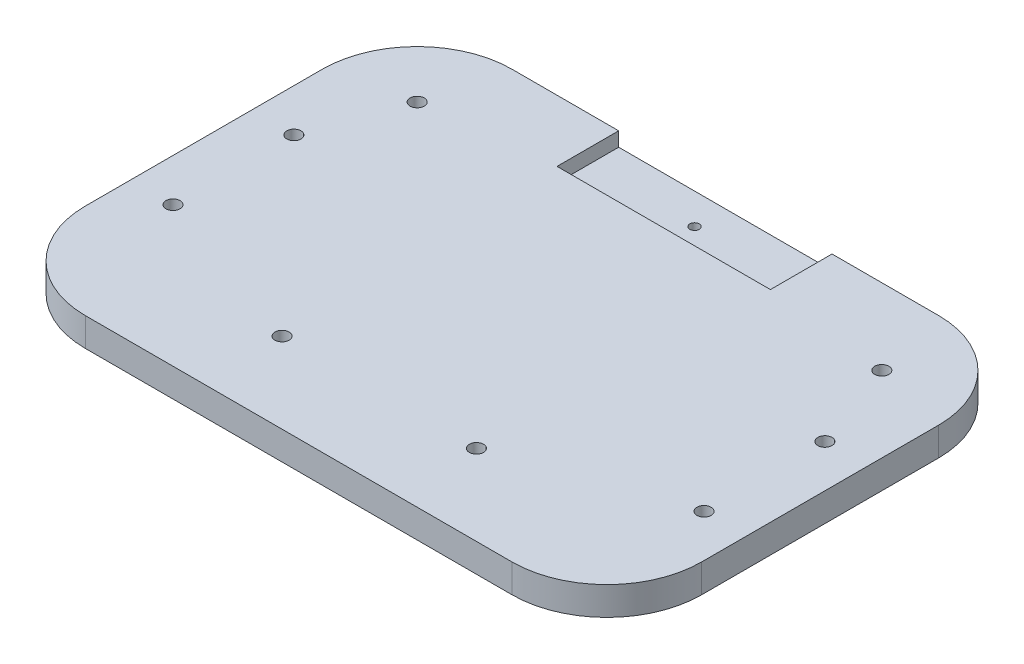
ISO-10303-21;
HEADER;
FILE_DESCRIPTION(('STEP AP214'),'2;1');
FILE_NAME('part.step','',(''),(''),'','','');
FILE_SCHEMA(('AUTOMOTIVE_DESIGN { 1 0 10303 214 1 1 1 1 }'));
ENDSEC;
DATA;
#1=APPLICATION_CONTEXT('core data for automotive mechanical design processes');
#2=APPLICATION_PROTOCOL_DEFINITION('international standard','automotive_design',2000,#1);
#3=PRODUCT_CONTEXT('',#1,'mechanical');
#4=PRODUCT('Part','Part','',(#3));
#5=PRODUCT_RELATED_PRODUCT_CATEGORY('part','',(#4));
#6=PRODUCT_DEFINITION_FORMATION('','',#4);
#7=PRODUCT_DEFINITION_CONTEXT('part definition',#1,'design');
#8=PRODUCT_DEFINITION('design','',#6,#7);
#9=PRODUCT_DEFINITION_SHAPE('','',#8);
#10=(LENGTH_UNIT() NAMED_UNIT(*) SI_UNIT(.MILLI.,.METRE.));
#11=(NAMED_UNIT(*) PLANE_ANGLE_UNIT() SI_UNIT($,.RADIAN.));
#12=(NAMED_UNIT(*) SI_UNIT($,.STERADIAN.) SOLID_ANGLE_UNIT());
#13=UNCERTAINTY_MEASURE_WITH_UNIT(LENGTH_MEASURE(1.E-05),#10,'distance_accuracy_value','');
#14=(GEOMETRIC_REPRESENTATION_CONTEXT(3) GLOBAL_UNCERTAINTY_ASSIGNED_CONTEXT((#13)) GLOBAL_UNIT_ASSIGNED_CONTEXT((#10,
#11,#12)) REPRESENTATION_CONTEXT('',''));
#15=CARTESIAN_POINT('',(0.,0.,0.));
#16=DIRECTION('',(0.,0.,1.));
#17=DIRECTION('',(1.,0.,0.));
#18=AXIS2_PLACEMENT_3D('',#15,#16,#17);
#19=CARTESIAN_POINT('',(-20.,6.,-70.));
#20=DIRECTION('',(0.,-1.,0.));
#21=DIRECTION('',(0.,0.,-1.));
#22=AXIS2_PLACEMENT_3D('',#19,#20,#21);
#23=CYLINDRICAL_SURFACE('',#22,20.);
#24=CARTESIAN_POINT('',(-20.,0.,-70.));
#25=DIRECTION('',(0.,1.,0.));
#26=DIRECTION('',(0.,0.,1.));
#27=AXIS2_PLACEMENT_3D('',#24,#25,#26);
#28=CIRCLE('',#27,20.);
#29=CARTESIAN_POINT('',(0.,0.,-70.));
#30=VERTEX_POINT('',#29);
#31=CARTESIAN_POINT('',(-20.,0.,-90.));
#32=VERTEX_POINT('',#31);
#33=EDGE_CURVE('E161',#30,#32,#28,.T.);
#34=ORIENTED_EDGE('',*,*,#33,.T.);
#35=DIRECTION('',(0.,-1.,0.));
#36=VECTOR('',#35,1.);
#37=CARTESIAN_POINT('',(-20.,6.,-90.));
#38=LINE('',#37,#36);
#39=CARTESIAN_POINT('',(-20.,6.,-90.));
#40=VERTEX_POINT('',#39);
#41=EDGE_CURVE('E11',#40,#32,#38,.T.);
#42=ORIENTED_EDGE('',*,*,#41,.F.);
#43=CARTESIAN_POINT('',(-20.,6.,-70.));
#44=DIRECTION('',(0.,1.,0.));
#45=DIRECTION('',(0.,0.,1.));
#46=AXIS2_PLACEMENT_3D('',#43,#44,#45);
#47=CIRCLE('',#46,20.);
#48=CARTESIAN_POINT('',(0.,6.,-70.));
#49=VERTEX_POINT('',#48);
#50=EDGE_CURVE('E185',#49,#40,#47,.T.);
#51=ORIENTED_EDGE('',*,*,#50,.F.);
#52=DIRECTION('',(0.,-1.,0.));
#53=VECTOR('',#52,1.);
#54=CARTESIAN_POINT('',(0.,6.,-70.));
#55=LINE('',#54,#53);
#56=EDGE_CURVE('E157',#49,#30,#55,.T.);
#57=ORIENTED_EDGE('',*,*,#56,.T.);
#58=EDGE_LOOP('',(#34,#42,#51,#57));
#59=FACE_BOUND('',#58,.T.);
#60=ADVANCED_FACE('F45',(#59),#23,.T.);
#61=CARTESIAN_POINT('',(-20.,6.,-90.));
#62=DIRECTION('',(0.,0.,1.));
#63=DIRECTION('',(1.,0.,0.));
#64=AXIS2_PLACEMENT_3D('',#61,#62,#63);
#65=PLANE('',#64);
#66=DIRECTION('',(-1.,0.,0.));
#67=VECTOR('',#66,1.);
#68=CARTESIAN_POINT('',(-20.,6.,-90.));
#69=LINE('',#68,#67);
#70=CARTESIAN_POINT('',(-87.5,6.,-90.));
#71=VERTEX_POINT('',#70);
#72=CARTESIAN_POINT('',(-110.,6.,-90.));
#73=VERTEX_POINT('',#72);
#74=EDGE_CURVE('E314',#71,#73,#69,.T.);
#75=ORIENTED_EDGE('',*,*,#74,.F.);
#76=DIRECTION('',(0.,1.,0.));
#77=VECTOR('',#76,1.);
#78=CARTESIAN_POINT('',(-87.5,3.,-90.));
#79=LINE('',#78,#77);
#80=CARTESIAN_POINT('',(-87.5,3.,-90.));
#81=VERTEX_POINT('',#80);
#82=EDGE_CURVE('E166',#81,#71,#79,.T.);
#83=ORIENTED_EDGE('',*,*,#82,.F.);
#84=DIRECTION('',(-1.,0.,0.));
#85=VECTOR('',#84,1.);
#86=CARTESIAN_POINT('',(-87.5,3.,-90.));
#87=LINE('',#86,#85);
#88=CARTESIAN_POINT('',(-42.5,3.,-90.));
#89=VERTEX_POINT('',#88);
#90=EDGE_CURVE('E287',#89,#81,#87,.T.);
#91=ORIENTED_EDGE('',*,*,#90,.F.);
#92=DIRECTION('',(0.,1.,0.));
#93=VECTOR('',#92,1.);
#94=CARTESIAN_POINT('',(-42.5,3.,-90.));
#95=LINE('',#94,#93);
#96=CARTESIAN_POINT('',(-42.5,6.,-90.));
#97=VERTEX_POINT('',#96);
#98=EDGE_CURVE('E303',#89,#97,#95,.T.);
#99=ORIENTED_EDGE('',*,*,#98,.T.);
#100=EDGE_CURVE('E112',#40,#97,#69,.T.);
#101=ORIENTED_EDGE('',*,*,#100,.F.);
#102=ORIENTED_EDGE('',*,*,#41,.T.);
#103=DIRECTION('',(-1.,0.,0.));
#104=VECTOR('',#103,1.);
#105=CARTESIAN_POINT('',(-20.,0.,-90.));
#106=LINE('',#105,#104);
#107=CARTESIAN_POINT('',(-110.,0.,-90.));
#108=VERTEX_POINT('',#107);
#109=EDGE_CURVE('E165',#32,#108,#106,.T.);
#110=ORIENTED_EDGE('',*,*,#109,.T.);
#111=DIRECTION('',(0.,-1.,0.));
#112=VECTOR('',#111,1.);
#113=CARTESIAN_POINT('',(-110.,6.,-90.));
#114=LINE('',#113,#112);
#115=EDGE_CURVE('E54',#73,#108,#114,.T.);
#116=ORIENTED_EDGE('',*,*,#115,.F.);
#117=EDGE_LOOP('',(#75,#83,#91,#99,#101,#102,#110,#116));
#118=FACE_BOUND('',#117,.T.);
#119=ADVANCED_FACE('F330',(#118),#65,.F.);
#120=CARTESIAN_POINT('',(-110.,6.,-70.));
#121=DIRECTION('',(0.,-1.,0.));
#122=DIRECTION('',(0.,0.,-1.));
#123=AXIS2_PLACEMENT_3D('',#120,#121,#122);
#124=CYLINDRICAL_SURFACE('',#123,20.);
#125=CARTESIAN_POINT('',(-110.,0.,-70.));
#126=DIRECTION('',(0.,1.,0.));
#127=DIRECTION('',(0.,0.,1.));
#128=AXIS2_PLACEMENT_3D('',#125,#126,#127);
#129=CIRCLE('',#128,20.);
#130=CARTESIAN_POINT('',(-130.,0.,-70.));
#131=VERTEX_POINT('',#130);
#132=EDGE_CURVE('E169',#108,#131,#129,.T.);
#133=ORIENTED_EDGE('',*,*,#132,.T.);
#134=DIRECTION('',(0.,-1.,0.));
#135=VECTOR('',#134,1.);
#136=CARTESIAN_POINT('',(-130.,6.,-70.));
#137=LINE('',#136,#135);
#138=CARTESIAN_POINT('',(-130.,6.,-70.));
#139=VERTEX_POINT('',#138);
#140=EDGE_CURVE('E196',#139,#131,#137,.T.);
#141=ORIENTED_EDGE('',*,*,#140,.F.);
#142=CARTESIAN_POINT('',(-110.,6.,-70.));
#143=DIRECTION('',(0.,1.,0.));
#144=DIRECTION('',(0.,0.,1.));
#145=AXIS2_PLACEMENT_3D('',#142,#143,#144);
#146=CIRCLE('',#145,20.);
#147=EDGE_CURVE('E317',#73,#139,#146,.T.);
#148=ORIENTED_EDGE('',*,*,#147,.F.);
#149=ORIENTED_EDGE('',*,*,#115,.T.);
#150=EDGE_LOOP('',(#133,#141,#148,#149));
#151=FACE_BOUND('',#150,.T.);
#152=ADVANCED_FACE('F333',(#151),#124,.T.);
#153=CARTESIAN_POINT('',(-130.,6.,-20.));
#154=DIRECTION('',(1.,0.,0.));
#155=DIRECTION('',(0.,0.,-1.));
#156=AXIS2_PLACEMENT_3D('',#153,#154,#155);
#157=PLANE('',#156);
#158=DIRECTION('',(0.,0.,1.));
#159=VECTOR('',#158,1.);
#160=CARTESIAN_POINT('',(-130.,0.,-20.));
#161=LINE('',#160,#159);
#162=CARTESIAN_POINT('',(-130.,0.,-20.));
#163=VERTEX_POINT('',#162);
#164=EDGE_CURVE('E172',#131,#163,#161,.T.);
#165=ORIENTED_EDGE('',*,*,#164,.T.);
#166=DIRECTION('',(0.,-1.,0.));
#167=VECTOR('',#166,1.);
#168=CARTESIAN_POINT('',(-130.,6.,-20.));
#169=LINE('',#168,#167);
#170=CARTESIAN_POINT('',(-130.,6.,-20.));
#171=VERTEX_POINT('',#170);
#172=EDGE_CURVE('E192',#171,#163,#169,.T.);
#173=ORIENTED_EDGE('',*,*,#172,.F.);
#174=DIRECTION('',(0.,0.,1.));
#175=VECTOR('',#174,1.);
#176=CARTESIAN_POINT('',(-130.,6.,-20.));
#177=LINE('',#176,#175);
#178=EDGE_CURVE('E320',#139,#171,#177,.T.);
#179=ORIENTED_EDGE('',*,*,#178,.F.);
#180=ORIENTED_EDGE('',*,*,#140,.T.);
#181=EDGE_LOOP('',(#165,#173,#179,#180));
#182=FACE_BOUND('',#181,.T.);
#183=ADVANCED_FACE('F338',(#182),#157,.F.);
#184=CARTESIAN_POINT('',(-110.,6.,-20.));
#185=DIRECTION('',(0.,-1.,0.));
#186=DIRECTION('',(0.,0.,-1.));
#187=AXIS2_PLACEMENT_3D('',#184,#185,#186);
#188=CYLINDRICAL_SURFACE('',#187,20.);
#189=CARTESIAN_POINT('',(-110.,0.,-20.));
#190=DIRECTION('',(0.,1.,0.));
#191=DIRECTION('',(0.,0.,-1.));
#192=AXIS2_PLACEMENT_3D('',#189,#190,#191);
#193=CIRCLE('',#192,20.);
#194=CARTESIAN_POINT('',(-110.,0.,0.));
#195=VERTEX_POINT('',#194);
#196=EDGE_CURVE('E175',#163,#195,#193,.T.);
#197=ORIENTED_EDGE('',*,*,#196,.T.);
#198=DIRECTION('',(0.,-1.,0.));
#199=VECTOR('',#198,1.);
#200=CARTESIAN_POINT('',(-110.,6.,0.));
#201=LINE('',#200,#199);
#202=CARTESIAN_POINT('',(-110.,6.,0.));
#203=VERTEX_POINT('',#202);
#204=EDGE_CURVE('E150',#203,#195,#201,.T.);
#205=ORIENTED_EDGE('',*,*,#204,.F.);
#206=CARTESIAN_POINT('',(-110.,6.,-20.));
#207=DIRECTION('',(0.,1.,0.));
#208=DIRECTION('',(0.,0.,-1.));
#209=AXIS2_PLACEMENT_3D('',#206,#207,#208);
#210=CIRCLE('',#209,20.);
#211=EDGE_CURVE('E136',#171,#203,#210,.T.);
#212=ORIENTED_EDGE('',*,*,#211,.F.);
#213=ORIENTED_EDGE('',*,*,#172,.T.);
#214=EDGE_LOOP('',(#197,#205,#212,#213));
#215=FACE_BOUND('',#214,.T.);
#216=ADVANCED_FACE('F341',(#215),#188,.T.);
#217=CARTESIAN_POINT('',(-20.,6.,0.));
#218=DIRECTION('',(0.,0.,-1.));
#219=DIRECTION('',(-1.,0.,0.));
#220=AXIS2_PLACEMENT_3D('',#217,#218,#219);
#221=PLANE('',#220);
#222=DIRECTION('',(1.,0.,0.));
#223=VECTOR('',#222,1.);
#224=CARTESIAN_POINT('',(-20.,0.,0.));
#225=LINE('',#224,#223);
#226=CARTESIAN_POINT('',(-20.,0.,0.));
#227=VERTEX_POINT('',#226);
#228=EDGE_CURVE('E146',#195,#227,#225,.T.);
#229=ORIENTED_EDGE('',*,*,#228,.T.);
#230=DIRECTION('',(0.,-1.,0.));
#231=VECTOR('',#230,1.);
#232=CARTESIAN_POINT('',(-20.,6.,0.));
#233=LINE('',#232,#231);
#234=CARTESIAN_POINT('',(-20.,6.,0.));
#235=VERTEX_POINT('',#234);
#236=EDGE_CURVE('E143',#235,#227,#233,.T.);
#237=ORIENTED_EDGE('',*,*,#236,.F.);
#238=DIRECTION('',(1.,0.,0.));
#239=VECTOR('',#238,1.);
#240=CARTESIAN_POINT('',(-20.,6.,0.));
#241=LINE('',#240,#239);
#242=EDGE_CURVE('E129',#203,#235,#241,.T.);
#243=ORIENTED_EDGE('',*,*,#242,.F.);
#244=ORIENTED_EDGE('',*,*,#204,.T.);
#245=EDGE_LOOP('',(#229,#237,#243,#244));
#246=FACE_BOUND('',#245,.T.);
#247=ADVANCED_FACE('F144',(#246),#221,.F.);
#248=CARTESIAN_POINT('',(-20.,6.,-20.));
#249=DIRECTION('',(0.,-1.,0.));
#250=DIRECTION('',(0.,0.,-1.));
#251=AXIS2_PLACEMENT_3D('',#248,#249,#250);
#252=CYLINDRICAL_SURFACE('',#251,20.);
#253=CARTESIAN_POINT('',(-20.,0.,-20.));
#254=DIRECTION('',(0.,1.,0.));
#255=DIRECTION('',(0.,0.,1.));
#256=AXIS2_PLACEMENT_3D('',#253,#254,#255);
#257=CIRCLE('',#256,20.);
#258=CARTESIAN_POINT('',(0.,0.,-20.));
#259=VERTEX_POINT('',#258);
#260=EDGE_CURVE('E180',#227,#259,#257,.T.);
#261=ORIENTED_EDGE('',*,*,#260,.T.);
#262=DIRECTION('',(0.,-1.,0.));
#263=VECTOR('',#262,1.);
#264=CARTESIAN_POINT('',(0.,6.,-20.));
#265=LINE('',#264,#263);
#266=CARTESIAN_POINT('',(0.,6.,-20.));
#267=VERTEX_POINT('',#266);
#268=EDGE_CURVE('E151',#267,#259,#265,.T.);
#269=ORIENTED_EDGE('',*,*,#268,.F.);
#270=CARTESIAN_POINT('',(-20.,6.,-20.));
#271=DIRECTION('',(0.,1.,0.));
#272=DIRECTION('',(0.,0.,1.));
#273=AXIS2_PLACEMENT_3D('',#270,#271,#272);
#274=CIRCLE('',#273,20.);
#275=EDGE_CURVE('E133',#235,#267,#274,.T.);
#276=ORIENTED_EDGE('',*,*,#275,.F.);
#277=ORIENTED_EDGE('',*,*,#236,.T.);
#278=EDGE_LOOP('',(#261,#269,#276,#277));
#279=FACE_BOUND('',#278,.T.);
#280=ADVANCED_FACE('F153',(#279),#252,.T.);
#281=CARTESIAN_POINT('',(0.,6.,-20.));
#282=DIRECTION('',(-1.,0.,0.));
#283=DIRECTION('',(0.,0.,1.));
#284=AXIS2_PLACEMENT_3D('',#281,#282,#283);
#285=PLANE('',#284);
#286=DIRECTION('',(0.,0.,-1.));
#287=VECTOR('',#286,1.);
#288=CARTESIAN_POINT('',(0.,0.,-20.));
#289=LINE('',#288,#287);
#290=EDGE_CURVE('E104',#259,#30,#289,.T.);
#291=ORIENTED_EDGE('',*,*,#290,.T.);
#292=ORIENTED_EDGE('',*,*,#56,.F.);
#293=DIRECTION('',(0.,0.,-1.));
#294=VECTOR('',#293,1.);
#295=CARTESIAN_POINT('',(0.,6.,-20.));
#296=LINE('',#295,#294);
#297=EDGE_CURVE('E71',#267,#49,#296,.T.);
#298=ORIENTED_EDGE('',*,*,#297,.F.);
#299=ORIENTED_EDGE('',*,*,#268,.T.);
#300=EDGE_LOOP('',(#291,#292,#298,#299));
#301=FACE_BOUND('',#300,.T.);
#302=ADVANCED_FACE('F345',(#301),#285,.F.);
#303=CARTESIAN_POINT('',(-20.,6.,-70.));
#304=DIRECTION('',(0.,1.,0.));
#305=DIRECTION('',(0.,0.,1.));
#306=AXIS2_PLACEMENT_3D('',#303,#304,#305);
#307=PLANE('',#306);
#308=CARTESIAN_POINT('',(-114.,6.,-74.));
#309=DIRECTION('',(0.,1.,0.));
#310=DIRECTION('',(0.,0.,1.));
#311=AXIS2_PLACEMENT_3D('',#308,#309,#310);
#312=CIRCLE('',#311,1.5);
#313=CARTESIAN_POINT('',(-114.,6.,-72.5));
#314=VERTEX_POINT('',#313);
#315=EDGE_CURVE('E241',#314,#314,#312,.T.);
#316=ORIENTED_EDGE('',*,*,#315,.F.);
#317=EDGE_LOOP('',(#316));
#318=FACE_BOUND('',#317,.T.);
#319=CARTESIAN_POINT('',(-16.,6.,-74.));
#320=DIRECTION('',(0.,1.,0.));
#321=DIRECTION('',(0.,0.,1.));
#322=AXIS2_PLACEMENT_3D('',#319,#320,#321);
#323=CIRCLE('',#322,1.5);
#324=CARTESIAN_POINT('',(-16.,6.,-72.5));
#325=VERTEX_POINT('',#324);
#326=EDGE_CURVE('E228',#325,#325,#323,.T.);
#327=ORIENTED_EDGE('',*,*,#326,.F.);
#328=EDGE_LOOP('',(#327));
#329=FACE_BOUND('',#328,.T.);
#330=CARTESIAN_POINT('',(-121.,6.,-55.));
#331=DIRECTION('',(0.,1.,0.));
#332=DIRECTION('',(0.,0.,1.));
#333=AXIS2_PLACEMENT_3D('',#330,#331,#332);
#334=CIRCLE('',#333,1.5);
#335=CARTESIAN_POINT('',(-121.,6.,-53.5));
#336=VERTEX_POINT('',#335);
#337=EDGE_CURVE('E224',#336,#336,#334,.T.);
#338=ORIENTED_EDGE('',*,*,#337,.F.);
#339=EDGE_LOOP('',(#338));
#340=FACE_BOUND('',#339,.T.);
#341=CARTESIAN_POINT('',(-9.,6.,-55.));
#342=DIRECTION('',(0.,1.,0.));
#343=DIRECTION('',(0.,0.,1.));
#344=AXIS2_PLACEMENT_3D('',#341,#342,#343);
#345=CIRCLE('',#344,1.5);
#346=CARTESIAN_POINT('',(-9.,6.,-53.5));
#347=VERTEX_POINT('',#346);
#348=EDGE_CURVE('E220',#347,#347,#345,.T.);
#349=ORIENTED_EDGE('',*,*,#348,.F.);
#350=EDGE_LOOP('',(#349));
#351=FACE_BOUND('',#350,.T.);
#352=CARTESIAN_POINT('',(-121.,6.,-29.5));
#353=DIRECTION('',(0.,1.,0.));
#354=DIRECTION('',(0.,0.,1.));
#355=AXIS2_PLACEMENT_3D('',#352,#353,#354);
#356=CIRCLE('',#355,1.5);
#357=CARTESIAN_POINT('',(-121.,6.,-28.));
#358=VERTEX_POINT('',#357);
#359=EDGE_CURVE('E219',#358,#358,#356,.T.);
#360=ORIENTED_EDGE('',*,*,#359,.F.);
#361=EDGE_LOOP('',(#360));
#362=FACE_BOUND('',#361,.T.);
#363=CARTESIAN_POINT('',(-9.00000000000001,6.,-29.5));
#364=DIRECTION('',(0.,1.,0.));
#365=DIRECTION('',(0.,0.,1.));
#366=AXIS2_PLACEMENT_3D('',#363,#364,#365);
#367=CIRCLE('',#366,1.5);
#368=CARTESIAN_POINT('',(-9.00000000000001,6.,-28.));
#369=VERTEX_POINT('',#368);
#370=EDGE_CURVE('E214',#369,#369,#367,.T.);
#371=ORIENTED_EDGE('',*,*,#370,.F.);
#372=EDGE_LOOP('',(#371));
#373=FACE_BOUND('',#372,.T.);
#374=CARTESIAN_POINT('',(-85.5,6.,-17.));
#375=DIRECTION('',(0.,1.,0.));
#376=DIRECTION('',(0.,0.,1.));
#377=AXIS2_PLACEMENT_3D('',#374,#375,#376);
#378=CIRCLE('',#377,1.5);
#379=CARTESIAN_POINT('',(-85.5,6.,-15.5));
#380=VERTEX_POINT('',#379);
#381=EDGE_CURVE('E213',#380,#380,#378,.T.);
#382=ORIENTED_EDGE('',*,*,#381,.F.);
#383=EDGE_LOOP('',(#382));
#384=FACE_BOUND('',#383,.T.);
#385=CARTESIAN_POINT('',(-44.5,6.,-17.));
#386=DIRECTION('',(0.,1.,0.));
#387=DIRECTION('',(0.,0.,1.));
#388=AXIS2_PLACEMENT_3D('',#385,#386,#387);
#389=CIRCLE('',#388,1.5);
#390=CARTESIAN_POINT('',(-44.5,6.,-15.5));
#391=VERTEX_POINT('',#390);
#392=EDGE_CURVE('E208',#391,#391,#389,.T.);
#393=ORIENTED_EDGE('',*,*,#392,.F.);
#394=EDGE_LOOP('',(#393));
#395=FACE_BOUND('',#394,.T.);
#396=DIRECTION('',(0.,0.,1.));
#397=VECTOR('',#396,1.);
#398=CARTESIAN_POINT('',(-87.5,6.,-90.));
#399=LINE('',#398,#397);
#400=CARTESIAN_POINT('',(-87.5,6.,-77.));
#401=VERTEX_POINT('',#400);
#402=EDGE_CURVE('E62',#71,#401,#399,.T.);
#403=ORIENTED_EDGE('',*,*,#402,.F.);
#404=ORIENTED_EDGE('',*,*,#74,.T.);
#405=ORIENTED_EDGE('',*,*,#147,.T.);
#406=ORIENTED_EDGE('',*,*,#178,.T.);
#407=ORIENTED_EDGE('',*,*,#211,.T.);
#408=ORIENTED_EDGE('',*,*,#242,.T.);
#409=ORIENTED_EDGE('',*,*,#275,.T.);
#410=ORIENTED_EDGE('',*,*,#297,.T.);
#411=ORIENTED_EDGE('',*,*,#50,.T.);
#412=ORIENTED_EDGE('',*,*,#100,.T.);
#413=DIRECTION('',(0.,0.,-1.));
#414=VECTOR('',#413,1.);
#415=CARTESIAN_POINT('',(-42.5,6.,-90.));
#416=LINE('',#415,#414);
#417=CARTESIAN_POINT('',(-42.5,6.,-77.));
#418=VERTEX_POINT('',#417);
#419=EDGE_CURVE('E279',#418,#97,#416,.T.);
#420=ORIENTED_EDGE('',*,*,#419,.F.);
#421=DIRECTION('',(1.,0.,0.));
#422=VECTOR('',#421,1.);
#423=CARTESIAN_POINT('',(-87.5,6.,-77.));
#424=LINE('',#423,#422);
#425=EDGE_CURVE('E294',#401,#418,#424,.T.);
#426=ORIENTED_EDGE('',*,*,#425,.F.);
#427=EDGE_LOOP('',(#403,#404,#405,#406,#407,#408,#409,#410,#411,#412,#420,#426));
#428=FACE_BOUND('',#427,.T.);
#429=ADVANCED_FACE('F131',(#318,#329,#340,#351,#362,#373,#384,#395,#428),#307,.T.);
#430=CARTESIAN_POINT('',(-20.,0.,-70.));
#431=DIRECTION('',(0.,1.,0.));
#432=DIRECTION('',(0.,0.,1.));
#433=AXIS2_PLACEMENT_3D('',#430,#431,#432);
#434=PLANE('',#433);
#435=CARTESIAN_POINT('',(-114.,0.,-74.));
#436=DIRECTION('',(0.,1.,0.));
#437=DIRECTION('',(0.,0.,1.));
#438=AXIS2_PLACEMENT_3D('',#435,#436,#437);
#439=CIRCLE('',#438,1.5);
#440=CARTESIAN_POINT('',(-114.,0.,-72.5));
#441=VERTEX_POINT('',#440);
#442=EDGE_CURVE('E48',#441,#441,#439,.T.);
#443=ORIENTED_EDGE('',*,*,#442,.T.);
#444=EDGE_LOOP('',(#443));
#445=FACE_BOUND('',#444,.T.);
#446=CARTESIAN_POINT('',(-16.,0.,-74.));
#447=DIRECTION('',(0.,1.,0.));
#448=DIRECTION('',(0.,0.,1.));
#449=AXIS2_PLACEMENT_3D('',#446,#447,#448);
#450=CIRCLE('',#449,1.5);
#451=CARTESIAN_POINT('',(-16.,0.,-72.5));
#452=VERTEX_POINT('',#451);
#453=EDGE_CURVE('E225',#452,#452,#450,.T.);
#454=ORIENTED_EDGE('',*,*,#453,.T.);
#455=EDGE_LOOP('',(#454));
#456=FACE_BOUND('',#455,.T.);
#457=CARTESIAN_POINT('',(-121.,0.,-55.));
#458=DIRECTION('',(0.,1.,0.));
#459=DIRECTION('',(0.,0.,1.));
#460=AXIS2_PLACEMENT_3D('',#457,#458,#459);
#461=CIRCLE('',#460,1.5);
#462=CARTESIAN_POINT('',(-121.,0.,-53.5));
#463=VERTEX_POINT('',#462);
#464=EDGE_CURVE('E221',#463,#463,#461,.T.);
#465=ORIENTED_EDGE('',*,*,#464,.T.);
#466=EDGE_LOOP('',(#465));
#467=FACE_BOUND('',#466,.T.);
#468=CARTESIAN_POINT('',(-9.,0.,-55.));
#469=DIRECTION('',(0.,1.,0.));
#470=DIRECTION('',(0.,0.,1.));
#471=AXIS2_PLACEMENT_3D('',#468,#469,#470);
#472=CIRCLE('',#471,1.5);
#473=CARTESIAN_POINT('',(-9.,0.,-53.5));
#474=VERTEX_POINT('',#473);
#475=EDGE_CURVE('E215',#474,#474,#472,.T.);
#476=ORIENTED_EDGE('',*,*,#475,.T.);
#477=EDGE_LOOP('',(#476));
#478=FACE_BOUND('',#477,.T.);
#479=CARTESIAN_POINT('',(-121.,0.,-29.5));
#480=DIRECTION('',(0.,1.,0.));
#481=DIRECTION('',(0.,0.,1.));
#482=AXIS2_PLACEMENT_3D('',#479,#480,#481);
#483=CIRCLE('',#482,1.5);
#484=CARTESIAN_POINT('',(-121.,0.,-28.));
#485=VERTEX_POINT('',#484);
#486=EDGE_CURVE('E250',#485,#485,#483,.T.);
#487=ORIENTED_EDGE('',*,*,#486,.T.);
#488=EDGE_LOOP('',(#487));
#489=FACE_BOUND('',#488,.T.);
#490=CARTESIAN_POINT('',(-9.00000000000001,0.,-29.5));
#491=DIRECTION('',(0.,1.,0.));
#492=DIRECTION('',(0.,0.,1.));
#493=AXIS2_PLACEMENT_3D('',#490,#491,#492);
#494=CIRCLE('',#493,1.5);
#495=CARTESIAN_POINT('',(-9.00000000000001,0.,-28.));
#496=VERTEX_POINT('',#495);
#497=EDGE_CURVE('E209',#496,#496,#494,.T.);
#498=ORIENTED_EDGE('',*,*,#497,.T.);
#499=EDGE_LOOP('',(#498));
#500=FACE_BOUND('',#499,.T.);
#501=CARTESIAN_POINT('',(-85.5,0.,-17.));
#502=DIRECTION('',(0.,1.,0.));
#503=DIRECTION('',(0.,0.,1.));
#504=AXIS2_PLACEMENT_3D('',#501,#502,#503);
#505=CIRCLE('',#504,1.5);
#506=CARTESIAN_POINT('',(-85.5,0.,-15.5));
#507=VERTEX_POINT('',#506);
#508=EDGE_CURVE('E260',#507,#507,#505,.T.);
#509=ORIENTED_EDGE('',*,*,#508,.T.);
#510=EDGE_LOOP('',(#509));
#511=FACE_BOUND('',#510,.T.);
#512=CARTESIAN_POINT('',(-44.5,0.,-17.));
#513=DIRECTION('',(0.,1.,0.));
#514=DIRECTION('',(0.,0.,1.));
#515=AXIS2_PLACEMENT_3D('',#512,#513,#514);
#516=CIRCLE('',#515,1.5);
#517=CARTESIAN_POINT('',(-44.5,0.,-15.5));
#518=VERTEX_POINT('',#517);
#519=EDGE_CURVE('E203',#518,#518,#516,.T.);
#520=ORIENTED_EDGE('',*,*,#519,.T.);
#521=EDGE_LOOP('',(#520));
#522=FACE_BOUND('',#521,.T.);
#523=CARTESIAN_POINT('',(-65.,0.,-83.5));
#524=DIRECTION('',(0.,1.,0.));
#525=DIRECTION('',(0.,0.,1.));
#526=AXIS2_PLACEMENT_3D('',#523,#524,#525);
#527=CIRCLE('',#526,1.);
#528=CARTESIAN_POINT('',(-65.,0.,-82.5));
#529=VERTEX_POINT('',#528);
#530=EDGE_CURVE('E270',#529,#529,#527,.T.);
#531=ORIENTED_EDGE('',*,*,#530,.T.);
#532=EDGE_LOOP('',(#531));
#533=FACE_BOUND('',#532,.T.);
#534=ORIENTED_EDGE('',*,*,#33,.F.);
#535=ORIENTED_EDGE('',*,*,#290,.F.);
#536=ORIENTED_EDGE('',*,*,#260,.F.);
#537=ORIENTED_EDGE('',*,*,#228,.F.);
#538=ORIENTED_EDGE('',*,*,#196,.F.);
#539=ORIENTED_EDGE('',*,*,#164,.F.);
#540=ORIENTED_EDGE('',*,*,#132,.F.);
#541=ORIENTED_EDGE('',*,*,#109,.F.);
#542=EDGE_LOOP('',(#534,#535,#536,#537,#538,#539,#540,#541));
#543=FACE_BOUND('',#542,.T.);
#544=ADVANCED_FACE('F344',(#445,#456,#467,#478,#489,#500,#511,#522,#533,#543),#434,.F.);
#545=CARTESIAN_POINT('',(-87.5,3.,-90.));
#546=DIRECTION('',(-1.,0.,0.));
#547=DIRECTION('',(0.,0.,1.));
#548=AXIS2_PLACEMENT_3D('',#545,#546,#547);
#549=PLANE('',#548);
#550=ORIENTED_EDGE('',*,*,#402,.T.);
#551=DIRECTION('',(0.,1.,0.));
#552=VECTOR('',#551,1.);
#553=CARTESIAN_POINT('',(-87.5,3.,-77.));
#554=LINE('',#553,#552);
#555=CARTESIAN_POINT('',(-87.5,3.,-77.));
#556=VERTEX_POINT('',#555);
#557=EDGE_CURVE('E291',#556,#401,#554,.T.);
#558=ORIENTED_EDGE('',*,*,#557,.F.);
#559=DIRECTION('',(0.,0.,1.));
#560=VECTOR('',#559,1.);
#561=CARTESIAN_POINT('',(-87.5,3.,-90.));
#562=LINE('',#561,#560);
#563=EDGE_CURVE('E274',#81,#556,#562,.T.);
#564=ORIENTED_EDGE('',*,*,#563,.F.);
#565=ORIENTED_EDGE('',*,*,#82,.T.);
#566=EDGE_LOOP('',(#550,#558,#564,#565));
#567=FACE_BOUND('',#566,.T.);
#568=ADVANCED_FACE('F365',(#567),#549,.F.);
#569=CARTESIAN_POINT('',(-42.5,3.,-90.));
#570=DIRECTION('',(1.,0.,0.));
#571=DIRECTION('',(0.,0.,-1.));
#572=AXIS2_PLACEMENT_3D('',#569,#570,#571);
#573=PLANE('',#572);
#574=ORIENTED_EDGE('',*,*,#419,.T.);
#575=ORIENTED_EDGE('',*,*,#98,.F.);
#576=DIRECTION('',(0.,0.,-1.));
#577=VECTOR('',#576,1.);
#578=CARTESIAN_POINT('',(-42.5,3.,-90.));
#579=LINE('',#578,#577);
#580=CARTESIAN_POINT('',(-42.5,3.,-77.));
#581=VERTEX_POINT('',#580);
#582=EDGE_CURVE('E283',#581,#89,#579,.T.);
#583=ORIENTED_EDGE('',*,*,#582,.F.);
#584=DIRECTION('',(0.,1.,0.));
#585=VECTOR('',#584,1.);
#586=CARTESIAN_POINT('',(-42.5,3.,-77.));
#587=LINE('',#586,#585);
#588=EDGE_CURVE('E306',#581,#418,#587,.T.);
#589=ORIENTED_EDGE('',*,*,#588,.T.);
#590=EDGE_LOOP('',(#574,#575,#583,#589));
#591=FACE_BOUND('',#590,.T.);
#592=ADVANCED_FACE('F372',(#591),#573,.F.);
#593=CARTESIAN_POINT('',(-87.5,3.,-77.));
#594=DIRECTION('',(0.,0.,1.));
#595=DIRECTION('',(1.,0.,0.));
#596=AXIS2_PLACEMENT_3D('',#593,#594,#595);
#597=PLANE('',#596);
#598=ORIENTED_EDGE('',*,*,#425,.T.);
#599=ORIENTED_EDGE('',*,*,#588,.F.);
#600=DIRECTION('',(1.,0.,0.));
#601=VECTOR('',#600,1.);
#602=CARTESIAN_POINT('',(-87.5,3.,-77.));
#603=LINE('',#602,#601);
#604=EDGE_CURVE('E278',#556,#581,#603,.T.);
#605=ORIENTED_EDGE('',*,*,#604,.F.);
#606=ORIENTED_EDGE('',*,*,#557,.T.);
#607=EDGE_LOOP('',(#598,#599,#605,#606));
#608=FACE_BOUND('',#607,.T.);
#609=ADVANCED_FACE('F367',(#608),#597,.F.);
#610=CARTESIAN_POINT('',(0.,3.,0.));
#611=DIRECTION('',(0.,1.,0.));
#612=DIRECTION('',(0.,0.,1.));
#613=AXIS2_PLACEMENT_3D('',#610,#611,#612);
#614=PLANE('',#613);
#615=CARTESIAN_POINT('',(-65.,3.,-83.5));
#616=DIRECTION('',(0.,1.,0.));
#617=DIRECTION('',(0.,0.,1.));
#618=AXIS2_PLACEMENT_3D('',#615,#616,#617);
#619=CIRCLE('',#618,1.);
#620=CARTESIAN_POINT('',(-65.,3.,-82.5));
#621=VERTEX_POINT('',#620);
#622=EDGE_CURVE('E207',#621,#621,#619,.T.);
#623=ORIENTED_EDGE('',*,*,#622,.F.);
#624=EDGE_LOOP('',(#623));
#625=FACE_BOUND('',#624,.T.);
#626=ORIENTED_EDGE('',*,*,#563,.T.);
#627=ORIENTED_EDGE('',*,*,#604,.T.);
#628=ORIENTED_EDGE('',*,*,#582,.T.);
#629=ORIENTED_EDGE('',*,*,#90,.T.);
#630=EDGE_LOOP('',(#626,#627,#628,#629));
#631=FACE_BOUND('',#630,.T.);
#632=ADVANCED_FACE('F370',(#625,#631),#614,.T.);
#633=CARTESIAN_POINT('',(-65.,3.,-83.5));
#634=DIRECTION('',(0.,1.,0.));
#635=DIRECTION('',(0.,0.,1.));
#636=AXIS2_PLACEMENT_3D('',#633,#634,#635);
#637=CYLINDRICAL_SURFACE('',#636,1.);
#638=ORIENTED_EDGE('',*,*,#622,.T.);
#639=EDGE_LOOP('',(#638));
#640=FACE_BOUND('',#639,.T.);
#641=ORIENTED_EDGE('',*,*,#530,.F.);
#642=EDGE_LOOP('',(#641));
#643=FACE_BOUND('',#642,.T.);
#644=ADVANCED_FACE('F429',(#640,#643),#637,.F.);
#645=CARTESIAN_POINT('',(-44.5,6.,-17.));
#646=DIRECTION('',(0.,1.,0.));
#647=DIRECTION('',(0.,0.,1.));
#648=AXIS2_PLACEMENT_3D('',#645,#646,#647);
#649=CYLINDRICAL_SURFACE('',#648,1.5);
#650=ORIENTED_EDGE('',*,*,#392,.T.);
#651=EDGE_LOOP('',(#650));
#652=FACE_BOUND('',#651,.T.);
#653=ORIENTED_EDGE('',*,*,#519,.F.);
#654=EDGE_LOOP('',(#653));
#655=FACE_BOUND('',#654,.T.);
#656=ADVANCED_FACE('F425',(#652,#655),#649,.F.);
#657=CARTESIAN_POINT('',(-85.5,6.,-17.));
#658=DIRECTION('',(0.,1.,0.));
#659=DIRECTION('',(0.,0.,1.));
#660=AXIS2_PLACEMENT_3D('',#657,#658,#659);
#661=CYLINDRICAL_SURFACE('',#660,1.5);
#662=ORIENTED_EDGE('',*,*,#381,.T.);
#663=EDGE_LOOP('',(#662));
#664=FACE_BOUND('',#663,.T.);
#665=ORIENTED_EDGE('',*,*,#508,.F.);
#666=EDGE_LOOP('',(#665));
#667=FACE_BOUND('',#666,.T.);
#668=ADVANCED_FACE('F428',(#664,#667),#661,.F.);
#669=CARTESIAN_POINT('',(-9.00000000000001,6.,-29.5));
#670=DIRECTION('',(0.,1.,0.));
#671=DIRECTION('',(0.,0.,1.));
#672=AXIS2_PLACEMENT_3D('',#669,#670,#671);
#673=CYLINDRICAL_SURFACE('',#672,1.5);
#674=ORIENTED_EDGE('',*,*,#370,.T.);
#675=EDGE_LOOP('',(#674));
#676=FACE_BOUND('',#675,.T.);
#677=ORIENTED_EDGE('',*,*,#497,.F.);
#678=EDGE_LOOP('',(#677));
#679=FACE_BOUND('',#678,.T.);
#680=ADVANCED_FACE('F445',(#676,#679),#673,.F.);
#681=CARTESIAN_POINT('',(-121.,6.,-29.5));
#682=DIRECTION('',(0.,1.,0.));
#683=DIRECTION('',(0.,0.,1.));
#684=AXIS2_PLACEMENT_3D('',#681,#682,#683);
#685=CYLINDRICAL_SURFACE('',#684,1.5);
#686=ORIENTED_EDGE('',*,*,#359,.T.);
#687=EDGE_LOOP('',(#686));
#688=FACE_BOUND('',#687,.T.);
#689=ORIENTED_EDGE('',*,*,#486,.F.);
#690=EDGE_LOOP('',(#689));
#691=FACE_BOUND('',#690,.T.);
#692=ADVANCED_FACE('F449',(#688,#691),#685,.F.);
#693=CARTESIAN_POINT('',(-9.,6.,-55.));
#694=DIRECTION('',(0.,1.,0.));
#695=DIRECTION('',(0.,0.,1.));
#696=AXIS2_PLACEMENT_3D('',#693,#694,#695);
#697=CYLINDRICAL_SURFACE('',#696,1.5);
#698=ORIENTED_EDGE('',*,*,#348,.T.);
#699=EDGE_LOOP('',(#698));
#700=FACE_BOUND('',#699,.T.);
#701=ORIENTED_EDGE('',*,*,#475,.F.);
#702=EDGE_LOOP('',(#701));
#703=FACE_BOUND('',#702,.T.);
#704=ADVANCED_FACE('F453',(#700,#703),#697,.F.);
#705=CARTESIAN_POINT('',(-121.,6.,-55.));
#706=DIRECTION('',(0.,1.,0.));
#707=DIRECTION('',(0.,0.,1.));
#708=AXIS2_PLACEMENT_3D('',#705,#706,#707);
#709=CYLINDRICAL_SURFACE('',#708,1.5);
#710=ORIENTED_EDGE('',*,*,#337,.T.);
#711=EDGE_LOOP('',(#710));
#712=FACE_BOUND('',#711,.T.);
#713=ORIENTED_EDGE('',*,*,#464,.F.);
#714=EDGE_LOOP('',(#713));
#715=FACE_BOUND('',#714,.T.);
#716=ADVANCED_FACE('F457',(#712,#715),#709,.F.);
#717=CARTESIAN_POINT('',(-16.,6.,-74.));
#718=DIRECTION('',(0.,1.,0.));
#719=DIRECTION('',(0.,0.,1.));
#720=AXIS2_PLACEMENT_3D('',#717,#718,#719);
#721=CYLINDRICAL_SURFACE('',#720,1.5);
#722=ORIENTED_EDGE('',*,*,#326,.T.);
#723=EDGE_LOOP('',(#722));
#724=FACE_BOUND('',#723,.T.);
#725=ORIENTED_EDGE('',*,*,#453,.F.);
#726=EDGE_LOOP('',(#725));
#727=FACE_BOUND('',#726,.T.);
#728=ADVANCED_FACE('F461',(#724,#727),#721,.F.);
#729=CARTESIAN_POINT('',(-114.,6.,-74.));
#730=DIRECTION('',(0.,1.,0.));
#731=DIRECTION('',(0.,0.,1.));
#732=AXIS2_PLACEMENT_3D('',#729,#730,#731);
#733=CYLINDRICAL_SURFACE('',#732,1.5);
#734=ORIENTED_EDGE('',*,*,#315,.T.);
#735=EDGE_LOOP('',(#734));
#736=FACE_BOUND('',#735,.T.);
#737=ORIENTED_EDGE('',*,*,#442,.F.);
#738=EDGE_LOOP('',(#737));
#739=FACE_BOUND('',#738,.T.);
#740=ADVANCED_FACE('F465',(#736,#739),#733,.F.);
#741=CLOSED_SHELL('',(#60,#119,#152,#183,#216,#247,#280,#302,#429,#544,#568,#592,#609,#632,#644,
#656,#668,#680,#692,#704,#716,#728,#740));
#742=MANIFOLD_SOLID_BREP('B2',#741);
#743=ADVANCED_BREP_SHAPE_REPRESENTATION('',(#18,#742),#14);
#744=SHAPE_DEFINITION_REPRESENTATION(#9,#743);
ENDSEC;
END-ISO-10303-21;
